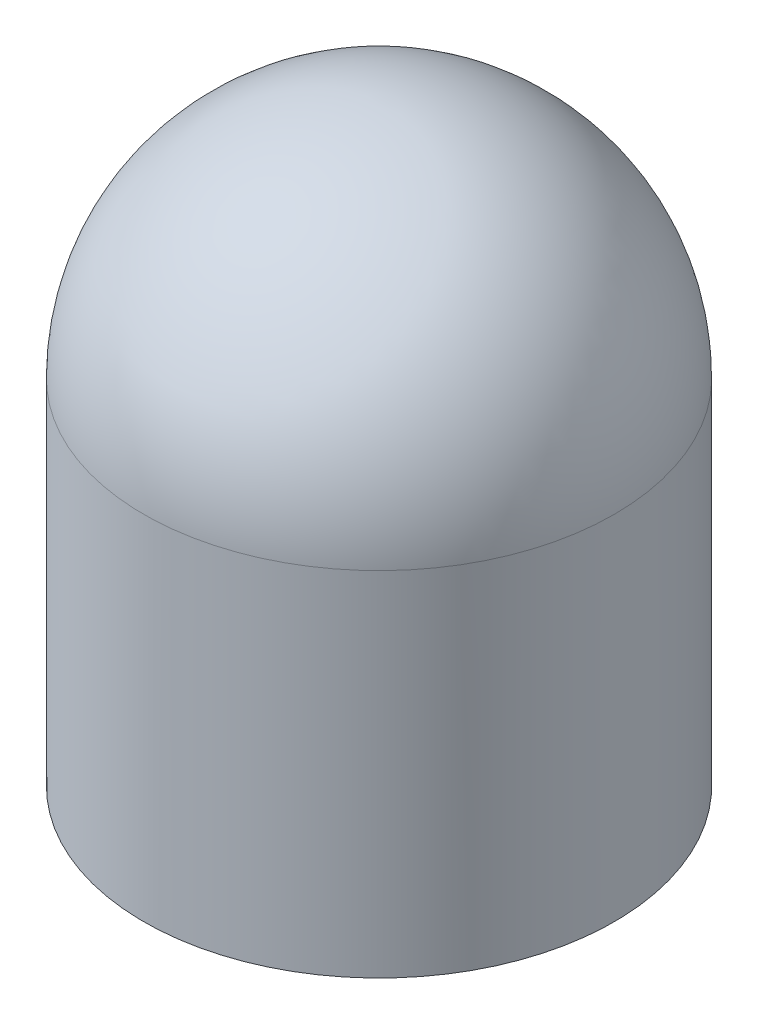
ISO-10303-21;
HEADER;
FILE_DESCRIPTION(('STEP AP214'),'2;1');
FILE_NAME('part.step','',(''),(''),'','','');
FILE_SCHEMA(('AUTOMOTIVE_DESIGN { 1 0 10303 214 1 1 1 1 }'));
ENDSEC;
DATA;
#1=APPLICATION_CONTEXT('core data for automotive mechanical design processes');
#2=APPLICATION_PROTOCOL_DEFINITION('international standard','automotive_design',2000,#1);
#3=PRODUCT_CONTEXT('',#1,'mechanical');
#4=PRODUCT('Part','Part','',(#3));
#5=PRODUCT_RELATED_PRODUCT_CATEGORY('part','',(#4));
#6=PRODUCT_DEFINITION_FORMATION('','',#4);
#7=PRODUCT_DEFINITION_CONTEXT('part definition',#1,'design');
#8=PRODUCT_DEFINITION('design','',#6,#7);
#9=PRODUCT_DEFINITION_SHAPE('','',#8);
#10=(LENGTH_UNIT() NAMED_UNIT(*) SI_UNIT(.MILLI.,.METRE.));
#11=(NAMED_UNIT(*) PLANE_ANGLE_UNIT() SI_UNIT($,.RADIAN.));
#12=(NAMED_UNIT(*) SI_UNIT($,.STERADIAN.) SOLID_ANGLE_UNIT());
#13=UNCERTAINTY_MEASURE_WITH_UNIT(LENGTH_MEASURE(1.E-05),#10,'distance_accuracy_value','');
#14=(GEOMETRIC_REPRESENTATION_CONTEXT(3) GLOBAL_UNCERTAINTY_ASSIGNED_CONTEXT((#13)) GLOBAL_UNIT_ASSIGNED_CONTEXT((#10,
#11,#12)) REPRESENTATION_CONTEXT('',''));
#15=CARTESIAN_POINT('',(0.,0.,0.));
#16=DIRECTION('',(0.,0.,1.));
#17=DIRECTION('',(1.,0.,0.));
#18=AXIS2_PLACEMENT_3D('',#15,#16,#17);
#19=CARTESIAN_POINT('',(-4.,-6.,0.));
#20=DIRECTION('',(0.,-1.,0.));
#21=DIRECTION('',(1.,0.,0.));
#22=AXIS2_PLACEMENT_3D('',#19,#20,#21);
#23=PLANE('',#22);
#24=CARTESIAN_POINT('',(0.,-6.,0.));
#25=DIRECTION('',(0.,1.,0.));
#26=DIRECTION('',(-1.,0.,0.));
#27=AXIS2_PLACEMENT_3D('',#24,#25,#26);
#28=CIRCLE('',#27,4.);
#29=CARTESIAN_POINT('',(-4.,-6.,0.));
#30=VERTEX_POINT('',#29);
#31=EDGE_CURVE('E220',#30,#30,#28,.T.);
#32=ORIENTED_EDGE('',*,*,#31,.F.);
#33=EDGE_LOOP('',(#32));
#34=FACE_BOUND('',#33,.T.);
#35=CARTESIAN_POINT('',(0.,-6.,0.));
#36=DIRECTION('',(0.,1.,0.));
#37=DIRECTION('',(-1.,0.,0.));
#38=AXIS2_PLACEMENT_3D('',#35,#36,#37);
#39=CIRCLE('',#38,1.5);
#40=CARTESIAN_POINT('',(-1.5,-6.,0.));
#41=VERTEX_POINT('',#40);
#42=EDGE_CURVE('E42',#41,#41,#39,.T.);
#43=ORIENTED_EDGE('',*,*,#42,.T.);
#44=EDGE_LOOP('',(#43));
#45=FACE_BOUND('',#44,.T.);
#46=CARTESIAN_POINT('',(-0.689240214724091,-6.,2.54134512307046));
#47=CARTESIAN_POINT('',(-0.689536199097216,-6.,2.51759825447027));
#48=CARTESIAN_POINT('',(-0.690112578303589,-6.,2.47135526828453));
#49=CARTESIAN_POINT('',(-0.693085762476472,-6.,2.40375862491754));
#50=CARTESIAN_POINT('',(-0.699013134150513,-6.,2.33982889306101));
#51=CARTESIAN_POINT('',(-0.706311274624241,-6.,2.27938663853422));
#52=CARTESIAN_POINT('',(-0.716548087620726,-6.,2.22261542787235));
#53=CARTESIAN_POINT('',(-0.729012581895578,-6.,2.16948526939035));
#54=CARTESIAN_POINT('',(-0.74299050428232,-6.,2.11971681982881));
#55=CARTESIAN_POINT('',(-0.760077837501126,-6.,2.07374625786807));
#56=CARTESIAN_POINT('',(-0.778998467582404,-6.,2.03079987183004));
#57=CARTESIAN_POINT('',(-0.799526075129496,-6.,1.99045447008974));
#58=CARTESIAN_POINT('',(-0.822133942785623,-6.,1.9526305464897));
#59=CARTESIAN_POINT('',(-0.847166636218612,-6.,1.91773848557038));
#60=CARTESIAN_POINT('',(-0.873431330692381,-6.,1.88468037576528));
#61=CARTESIAN_POINT('',(-0.902069059262447,-6.,1.85460516888828));
#62=CARTESIAN_POINT('',(-0.93255790979147,-6.,1.82693961195807));
#63=CARTESIAN_POINT('',(-0.964824140324806,-6.,1.80203603615234));
#64=CARTESIAN_POINT('',(-0.998498431339888,-6.,1.77957801286812));
#65=CARTESIAN_POINT('',(-1.0337920285347,-6.,1.76062072744707));
#66=CARTESIAN_POINT('',(-1.06981526151234,-6.,1.74379424892377));
#67=CARTESIAN_POINT('',(-1.10737243366101,-6.,1.73104226542974));
#68=CARTESIAN_POINT('',(-1.14570222323156,-6.,1.7201594937138));
#69=CARTESIAN_POINT('',(-1.18545004671189,-6.,1.71312980410232));
#70=CARTESIAN_POINT('',(-1.22624692810089,-6.,1.70847554974479));
#71=CARTESIAN_POINT('',(-1.25379872222199,-6.,1.70784441290312));
#72=CARTESIAN_POINT('',(-1.26769824757665,-6.,1.70752601249354));
#73=B_SPLINE_CURVE_WITH_KNOTS('',3,(#46,#47,#48,#49,#50,#51,#52,#53,#54,#55,#56,#57,#58,#59,#60,
#61,#62,#63,#64,#65,#66,#67,#68,#69,#70,#71,#72),.UNSPECIFIED.,.F.,.F.,(4,1,1,1,1,1,1,1,1,1,1,1,
1,1,1,1,1,1,1,1,1,1,1,1,4),(0.,0.0623586453206339,0.12143285174451,0.177603568781527,
0.230908870189653,0.281248082532962,0.328981984140903,0.374173859287638,0.416883780346531,
0.457636953082946,0.497347357171603,0.535678859847328,0.573212797882683,0.610031936792102,
0.64645653009802,0.682124568197924,0.718035057366356,0.753392216561028,0.788268423631282,
0.823144630701536,0.857652357822317,0.892293412913463,0.927670287386935,0.963510591363239,1.),.UNSPECIFIED.);
#74=CARTESIAN_POINT('',(-0.689240214724091,-6.,2.54134512307046));
#75=VERTEX_POINT('',#74);
#76=CARTESIAN_POINT('',(-1.26769824757665,-6.,1.70752601249354));
#77=VERTEX_POINT('',#76);
#78=EDGE_CURVE('E198',#75,#77,#73,.T.);
#79=ORIENTED_EDGE('',*,*,#78,.T.);
#80=CARTESIAN_POINT('',(-1.26769824757665,-6.,1.70752601249354));
#81=CARTESIAN_POINT('',(-1.28053558986095,-6.,1.70774414392937));
#82=CARTESIAN_POINT('',(-1.30596086167798,-6.,1.70817616879284));
#83=CARTESIAN_POINT('',(-1.34350535563089,-6.,1.71241331828519));
#84=CARTESIAN_POINT('',(-1.38007908003425,-6.,1.71944550524835));
#85=CARTESIAN_POINT('',(-1.41557461639022,-6.,1.72930141508242));
#86=CARTESIAN_POINT('',(-1.45024136222225,-6.,1.74181463360485));
#87=CARTESIAN_POINT('',(-1.4839289806116,-6.,1.75697264850056));
#88=CARTESIAN_POINT('',(-1.51641605222219,-6.,1.77532715100472));
#89=CARTESIAN_POINT('',(-1.54801260969687,-6.,1.79594997851893));
#90=CARTESIAN_POINT('',(-1.57825976304605,-6.,1.81940692806055));
#91=CARTESIAN_POINT('',(-1.60643289971863,-6.,1.84591915253008));
#92=CARTESIAN_POINT('',(-1.63320939403412,-6.,1.87485304777998));
#93=CARTESIAN_POINT('',(-1.65805878504017,-6.,1.90652062850967));
#94=CARTESIAN_POINT('',(-1.68153021000039,-6.,1.94071746729887));
#95=CARTESIAN_POINT('',(-1.70268935037513,-6.,1.97776574264178));
#96=CARTESIAN_POINT('',(-1.72241653500416,-6.,2.01726976624226));
#97=CARTESIAN_POINT('',(-1.74070611243833,-6.,2.05953381487989));
#98=CARTESIAN_POINT('',(-1.75721987654702,-6.,2.1052922044059));
#99=CARTESIAN_POINT('',(-1.7703910907676,-6.,2.15544015771024));
#100=CARTESIAN_POINT('',(-1.78281141768306,-6.,2.20943046625308));
#101=CARTESIAN_POINT('',(-1.79192614964581,-6.,2.26780931408946));
#102=CARTESIAN_POINT('',(-1.79983435768237,-6.,2.33013628007546));
#103=CARTESIAN_POINT('',(-1.80442236132525,-6.,2.39681596500461));
#104=CARTESIAN_POINT('',(-1.80834316360539,-6.,2.46762722315272));
#105=CARTESIAN_POINT('',(-1.80853345422731,-6.,2.51632197046676));
#106=CARTESIAN_POINT('',(-1.80863124036512,-6.,2.54134512307046));
#107=B_SPLINE_CURVE_WITH_KNOTS('',3,(#80,#81,#82,#83,#84,#85,#86,#87,#88,#89,#90,#91,#92,#93,
#94,#95,#96,#97,#98,#99,#100,#101,#102,#103,#104,#105,#106),.UNSPECIFIED.,.F.,.F.,(4,1,1,1,1,1,
1,1,1,1,1,1,1,1,1,1,1,1,1,1,1,1,1,1,4),(0.,0.0344225308328632,0.0681762769639792,
0.101187772496387,0.134229865398911,0.166878146477554,0.199963028159511,0.233185680290985,
0.266859095929362,0.30109795070752,0.335699678315082,0.370509883523512,0.406744747626816,
0.44357378340377,0.481662118120272,0.521080332339255,0.561961378968866,0.605128761767043,
0.651412326594914,0.700940996887038,0.753667628438233,0.809812230705577,0.869410747775484,
0.932893074365033,1.),.UNSPECIFIED.);
#108=CARTESIAN_POINT('',(-1.80863124036512,-6.,2.54134512307046));
#109=VERTEX_POINT('',#108);
#110=EDGE_CURVE('E49',#77,#109,#107,.T.);
#111=ORIENTED_EDGE('',*,*,#110,.T.);
#112=CARTESIAN_POINT('',(-1.80863124036512,-6.,2.54134512307046));
#113=CARTESIAN_POINT('',(-1.80847972134234,-6.,2.56657694528547));
#114=CARTESIAN_POINT('',(-1.80818546548435,-6.,2.61557812915216));
#115=CARTESIAN_POINT('',(-1.80501472884601,-6.,2.68686230099009));
#116=CARTESIAN_POINT('',(-1.7995449734972,-6.,2.75377319847406));
#117=CARTESIAN_POINT('',(-1.79251926508434,-6.,2.81631280699261));
#118=CARTESIAN_POINT('',(-1.7827993838769,-6.,2.87452409488967));
#119=CARTESIAN_POINT('',(-1.77167782639397,-6.,2.92843582799789));
#120=CARTESIAN_POINT('',(-1.75798752965164,-6.,2.97805463901731));
#121=CARTESIAN_POINT('',(-1.74199679399402,-6.,3.02346906767935));
#122=CARTESIAN_POINT('',(-1.72404241371625,-6.,3.06548568952795));
#123=CARTESIAN_POINT('',(-1.70430148730477,-6.,3.10463080226668));
#124=CARTESIAN_POINT('',(-1.68289904357066,-6.,3.14140140395366));
#125=CARTESIAN_POINT('',(-1.65997963303194,-6.,3.17578468772339));
#126=CARTESIAN_POINT('',(-1.63445969455221,-6.,3.20701464233675));
#127=CARTESIAN_POINT('',(-1.60783742221483,-6.,3.23616080368768));
#128=CARTESIAN_POINT('',(-1.57911321187012,-6.,3.262654215638));
#129=CARTESIAN_POINT('',(-1.54855029558827,-6.,3.28636224129231));
#130=CARTESIAN_POINT('',(-1.51693460237058,-6.,3.30779656352852));
#131=CARTESIAN_POINT('',(-1.48389229946679,-6.,3.32586283902085));
#132=CARTESIAN_POINT('',(-1.45018899082498,-6.,3.34160028641933));
#133=CARTESIAN_POINT('',(-1.41539488397182,-6.,3.35433051551227));
#134=CARTESIAN_POINT('',(-1.37976225185001,-6.,3.36421947660066));
#135=CARTESIAN_POINT('',(-1.34316348254342,-6.,3.37112548898255));
#136=CARTESIAN_POINT('',(-1.30577260726787,-6.,3.37588126374165));
#137=CARTESIAN_POINT('',(-1.28043350848277,-6.,3.37625062860409));
#138=CARTESIAN_POINT('',(-1.26769824757665,-6.,3.37643626890379));
#139=B_SPLINE_CURVE_WITH_KNOTS('',3,(#112,#113,#114,#115,#116,#117,#118,#119,#120,#121,#122,
#123,#124,#125,#126,#127,#128,#129,#130,#131,#132,#133,#134,#135,#136,#137,#138),.UNSPECIFIED.,
.F.,.F.,(4,1,1,1,1,1,1,1,1,1,1,1,1,1,1,1,1,1,1,1,1,1,1,1,4),(0.,0.0676053550869947,
0.131292239092441,0.191134407589382,0.247469080878901,0.299860761122208,0.349217260576119,
0.394905185014992,0.437665207287398,0.478130768490371,0.517254263570062,0.555057411187313,
0.592083229925926,0.627836499527122,0.663011964810908,0.697786070664216,0.732388072475915,
0.76657726534607,0.800013696791229,0.833182443527639,0.866160928196942,0.89916875533635,
0.932146016836145,0.965897043677855,1.),.UNSPECIFIED.);
#140=CARTESIAN_POINT('',(-1.26769824757665,-6.,3.37643626890379));
#141=VERTEX_POINT('',#140);
#142=EDGE_CURVE('E182',#109,#141,#139,.T.);
#143=ORIENTED_EDGE('',*,*,#142,.T.);
#144=CARTESIAN_POINT('',(-1.26769824757665,-6.,3.37643626890379));
#145=CARTESIAN_POINT('',(-1.25380546877539,-6.,3.37607041699541));
#146=CARTESIAN_POINT('',(-1.22638359099794,-6.,3.37534829030933));
#147=CARTESIAN_POINT('',(-1.18568820173261,-6.,3.37141843334135));
#148=CARTESIAN_POINT('',(-1.14635723423574,-6.,3.36347881464248));
#149=CARTESIAN_POINT('',(-1.10785104859553,-6.,3.35352222364146));
#150=CARTESIAN_POINT('',(-1.07079334913682,-6.,3.33991134820215));
#151=CARTESIAN_POINT('',(-1.03445006891413,-6.,3.32425946550055));
#152=CARTESIAN_POINT('',(-0.999939833413975,-6.,3.30443489085294));
#153=CARTESIAN_POINT('',(-0.966085568087182,-6.,3.28274949915098));
#154=CARTESIAN_POINT('',(-0.934048036061106,-6.,3.25774195999854));
#155=CARTESIAN_POINT('',(-0.903405407764587,-6.,3.23056951795135));
#156=CARTESIAN_POINT('',(-0.875113050886327,-6.,3.20030463893899));
#157=CARTESIAN_POINT('',(-0.848139657402634,-6.,3.16798873015798));
#158=CARTESIAN_POINT('',(-0.823868807181571,-6.,3.13235616898861));
#159=CARTESIAN_POINT('',(-0.800763662400706,-6.,3.09465465428405));
#160=CARTESIAN_POINT('',(-0.780305531589507,-6.,3.05394524045789));
#161=CARTESIAN_POINT('',(-0.760895229415662,-6.,3.01094807583721));
#162=CARTESIAN_POINT('',(-0.744210920441577,-6.,2.96451986635338));
#163=CARTESIAN_POINT('',(-0.729110025141549,-6.,2.91492575032445));
#164=CARTESIAN_POINT('',(-0.716872401623192,-6.,2.86154784350466));
#165=CARTESIAN_POINT('',(-0.706720881778917,-6.,2.80455203286641));
#166=CARTESIAN_POINT('',(-0.698897695077107,-6.,2.74384236116663));
#167=CARTESIAN_POINT('',(-0.693120071652077,-6.,2.67956303752912));
#168=CARTESIAN_POINT('',(-0.69010359629423,-6.,2.61165396632493));
#169=CARTESIAN_POINT('',(-0.689533128750874,-6.,2.56519836143967));
#170=CARTESIAN_POINT('',(-0.689240214724091,-6.,2.54134512307046));
#171=B_SPLINE_CURVE_WITH_KNOTS('',3,(#144,#145,#146,#147,#148,#149,#150,#151,#152,#153,#154,
#155,#156,#157,#158,#159,#160,#161,#162,#163,#164,#165,#166,#167,#168,#169,#170),.UNSPECIFIED.,
.F.,.F.,(4,1,1,1,1,1,1,1,1,1,1,1,1,1,1,1,1,1,1,1,1,1,1,1,4),(0.,0.0364607246479962,
0.0719669944563689,0.107094350499589,0.141635469301944,0.1762090447318,0.210576168718885,
0.245316025921393,0.280492893555501,0.315984999859498,0.351831672796789,0.387834451996472,
0.424584677800379,0.46215711148296,0.500840299552222,0.540519487657194,0.581607489200195,
0.624544950174747,0.66985862220502,0.717555000631616,0.768128401084353,0.821703127541867,
0.878106709824406,0.937412294741432,1.),.UNSPECIFIED.);
#172=EDGE_CURVE('E190',#141,#75,#171,.T.);
#173=ORIENTED_EDGE('',*,*,#172,.T.);
#174=EDGE_LOOP('',(#79,#111,#143,#173));
#175=FACE_BOUND('',#174,.T.);
#176=ADVANCED_FACE('F34',(#34,#45,#175),#23,.T.);
#177=CARTESIAN_POINT('',(0.,0.,0.));
#178=DIRECTION('',(0.,1.,0.));
#179=DIRECTION('',(1.,0.,0.));
#180=AXIS2_PLACEMENT_3D('',#177,#178,#179);
#181=SPHERICAL_SURFACE('',#180,4.);
#182=CARTESIAN_POINT('',(0.,0.,0.));
#183=DIRECTION('',(0.,1.,0.));
#184=DIRECTION('',(-1.,0.,0.));
#185=AXIS2_PLACEMENT_3D('',#182,#183,#184);
#186=CIRCLE('',#185,4.);
#187=CARTESIAN_POINT('',(-4.,0.,0.));
#188=VERTEX_POINT('',#187);
#189=EDGE_CURVE('E217',#188,#188,#186,.T.);
#190=ORIENTED_EDGE('',*,*,#189,.T.);
#191=EDGE_LOOP('',(#190));
#192=FACE_BOUND('',#191,.T.);
#193=ADVANCED_FACE('F36',(#192),#181,.T.);
#194=CARTESIAN_POINT('',(-1.5,-3.,0.));
#195=DIRECTION('',(0.,-1.,0.));
#196=DIRECTION('',(1.,0.,0.));
#197=AXIS2_PLACEMENT_3D('',#194,#195,#196);
#198=PLANE('',#197);
#199=CARTESIAN_POINT('',(0.,-3.,0.));
#200=DIRECTION('',(0.,1.,0.));
#201=DIRECTION('',(-1.,0.,0.));
#202=AXIS2_PLACEMENT_3D('',#199,#200,#201);
#203=CIRCLE('',#202,1.5);
#204=CARTESIAN_POINT('',(-1.5,-3.,0.));
#205=VERTEX_POINT('',#204);
#206=EDGE_CURVE('E11',#205,#205,#203,.T.);
#207=ORIENTED_EDGE('',*,*,#206,.F.);
#208=EDGE_LOOP('',(#207));
#209=FACE_BOUND('',#208,.T.);
#210=ADVANCED_FACE('F230',(#209),#198,.T.);
#211=CARTESIAN_POINT('',(0.,4.,0.));
#212=DIRECTION('',(0.,1.,0.));
#213=DIRECTION('',(-1.,0.,0.));
#214=AXIS2_PLACEMENT_3D('',#211,#212,#213);
#215=CYLINDRICAL_SURFACE('',#214,1.5);
#216=ORIENTED_EDGE('',*,*,#206,.T.);
#217=EDGE_LOOP('',(#216));
#218=FACE_BOUND('',#217,.T.);
#219=ORIENTED_EDGE('',*,*,#42,.F.);
#220=EDGE_LOOP('',(#219));
#221=FACE_BOUND('',#220,.T.);
#222=ADVANCED_FACE('F227',(#218,#221),#215,.F.);
#223=CARTESIAN_POINT('',(0.,4.,0.));
#224=DIRECTION('',(0.,1.,0.));
#225=DIRECTION('',(-1.,0.,0.));
#226=AXIS2_PLACEMENT_3D('',#223,#224,#225);
#227=CYLINDRICAL_SURFACE('',#226,4.);
#228=ORIENTED_EDGE('',*,*,#31,.T.);
#229=EDGE_LOOP('',(#228));
#230=FACE_BOUND('',#229,.T.);
#231=ORIENTED_EDGE('',*,*,#189,.F.);
#232=EDGE_LOOP('',(#231));
#233=FACE_BOUND('',#232,.T.);
#234=ADVANCED_FACE('F229',(#230,#233),#227,.T.);
#235=CARTESIAN_POINT('',(-1.26769824757665,-5.,1.70752601249354));
#236=CARTESIAN_POINT('',(-1.28053558986095,-5.,1.70774414392937));
#237=CARTESIAN_POINT('',(-1.30596086167798,-5.,1.70817616879284));
#238=CARTESIAN_POINT('',(-1.34350535563089,-5.,1.71241331828519));
#239=CARTESIAN_POINT('',(-1.38007908003425,-5.,1.71944550524835));
#240=CARTESIAN_POINT('',(-1.41557461639022,-5.,1.72930141508242));
#241=CARTESIAN_POINT('',(-1.45024136222225,-5.,1.74181463360485));
#242=CARTESIAN_POINT('',(-1.4839289806116,-5.,1.75697264850056));
#243=CARTESIAN_POINT('',(-1.51641605222219,-5.,1.77532715100472));
#244=CARTESIAN_POINT('',(-1.54801260969687,-5.,1.79594997851893));
#245=CARTESIAN_POINT('',(-1.57825976304605,-5.,1.81940692806055));
#246=CARTESIAN_POINT('',(-1.60643289971863,-5.,1.84591915253008));
#247=CARTESIAN_POINT('',(-1.63320939403412,-5.,1.87485304777998));
#248=CARTESIAN_POINT('',(-1.65805878504017,-5.,1.90652062850967));
#249=CARTESIAN_POINT('',(-1.68153021000039,-5.,1.94071746729887));
#250=CARTESIAN_POINT('',(-1.70268935037513,-5.,1.97776574264178));
#251=CARTESIAN_POINT('',(-1.72241653500416,-5.,2.01726976624226));
#252=CARTESIAN_POINT('',(-1.74070611243833,-5.,2.05953381487989));
#253=CARTESIAN_POINT('',(-1.75721987654702,-5.,2.1052922044059));
#254=CARTESIAN_POINT('',(-1.7703910907676,-5.,2.15544015771024));
#255=CARTESIAN_POINT('',(-1.78281141768306,-5.,2.20943046625308));
#256=CARTESIAN_POINT('',(-1.79192614964581,-5.,2.26780931408946));
#257=CARTESIAN_POINT('',(-1.79983435768237,-5.,2.33013628007546));
#258=CARTESIAN_POINT('',(-1.80442236132525,-5.,2.39681596500461));
#259=CARTESIAN_POINT('',(-1.80834316360539,-5.,2.46762722315272));
#260=CARTESIAN_POINT('',(-1.80853345422731,-5.,2.51632197046676));
#261=CARTESIAN_POINT('',(-1.80863124036512,-5.,2.54134512307046));
#262=B_SPLINE_CURVE_WITH_KNOTS('',3,(#235,#236,#237,#238,#239,#240,#241,#242,#243,#244,#245,
#246,#247,#248,#249,#250,#251,#252,#253,#254,#255,#256,#257,#258,#259,#260,#261),.UNSPECIFIED.,
.F.,.F.,(4,1,1,1,1,1,1,1,1,1,1,1,1,1,1,1,1,1,1,1,1,1,1,1,4),(0.,0.0344225308328632,
0.0681762769639792,0.101187772496387,0.134229865398911,0.166878146477554,0.199963028159511,
0.233185680290985,0.266859095929362,0.30109795070752,0.335699678315082,0.370509883523512,
0.406744747626816,0.44357378340377,0.481662118120272,0.521080332339255,0.561961378968866,
0.605128761767043,0.651412326594914,0.700940996887038,0.753667628438233,0.809812230705577,
0.869410747775484,0.932893074365033,1.),.UNSPECIFIED.);
#263=DIRECTION('',(0.,-1.,0.));
#264=VECTOR('',#263,1.);
#265=SURFACE_OF_LINEAR_EXTRUSION('',#262,#264);
#266=ORIENTED_EDGE('',*,*,#110,.F.);
#267=DIRECTION('',(0.,-1.,0.));
#268=VECTOR('',#267,1.);
#269=CARTESIAN_POINT('',(-1.26769824757665,-5.,1.70752601249354));
#270=LINE('',#269,#268);
#271=CARTESIAN_POINT('',(-1.26769824757665,-5.,1.70752601249354));
#272=VERTEX_POINT('',#271);
#273=EDGE_CURVE('E170',#272,#77,#270,.T.);
#274=ORIENTED_EDGE('',*,*,#273,.F.);
#275=CARTESIAN_POINT('',(-1.80863124036512,-5.,2.54134512307046));
#276=VERTEX_POINT('',#275);
#277=EDGE_CURVE('E206',#272,#276,#262,.T.);
#278=ORIENTED_EDGE('',*,*,#277,.T.);
#279=DIRECTION('',(0.,-1.,0.));
#280=VECTOR('',#279,1.);
#281=CARTESIAN_POINT('',(-1.80863124036512,-5.,2.54134512307046));
#282=LINE('',#281,#280);
#283=EDGE_CURVE('E215',#276,#109,#282,.T.);
#284=ORIENTED_EDGE('',*,*,#283,.T.);
#285=EDGE_LOOP('',(#266,#274,#278,#284));
#286=FACE_BOUND('',#285,.T.);
#287=ADVANCED_FACE('F237',(#286),#265,.T.);
#288=CARTESIAN_POINT('',(-1.80863124036512,-5.,2.54134512307046));
#289=CARTESIAN_POINT('',(-1.80847972134234,-5.,2.56657694528547));
#290=CARTESIAN_POINT('',(-1.80818546548435,-5.,2.61557812915216));
#291=CARTESIAN_POINT('',(-1.80501472884601,-5.,2.68686230099009));
#292=CARTESIAN_POINT('',(-1.7995449734972,-5.,2.75377319847406));
#293=CARTESIAN_POINT('',(-1.79251926508434,-5.,2.81631280699261));
#294=CARTESIAN_POINT('',(-1.7827993838769,-5.,2.87452409488967));
#295=CARTESIAN_POINT('',(-1.77167782639397,-5.,2.92843582799789));
#296=CARTESIAN_POINT('',(-1.75798752965164,-5.,2.97805463901731));
#297=CARTESIAN_POINT('',(-1.74199679399402,-5.,3.02346906767935));
#298=CARTESIAN_POINT('',(-1.72404241371625,-5.,3.06548568952795));
#299=CARTESIAN_POINT('',(-1.70430148730477,-5.,3.10463080226668));
#300=CARTESIAN_POINT('',(-1.68289904357066,-5.,3.14140140395366));
#301=CARTESIAN_POINT('',(-1.65997963303194,-5.,3.17578468772339));
#302=CARTESIAN_POINT('',(-1.63445969455221,-5.,3.20701464233675));
#303=CARTESIAN_POINT('',(-1.60783742221483,-5.,3.23616080368768));
#304=CARTESIAN_POINT('',(-1.57911321187012,-5.,3.262654215638));
#305=CARTESIAN_POINT('',(-1.54855029558827,-5.,3.28636224129231));
#306=CARTESIAN_POINT('',(-1.51693460237058,-5.,3.30779656352852));
#307=CARTESIAN_POINT('',(-1.48389229946679,-5.,3.32586283902085));
#308=CARTESIAN_POINT('',(-1.45018899082498,-5.,3.34160028641933));
#309=CARTESIAN_POINT('',(-1.41539488397182,-5.,3.35433051551227));
#310=CARTESIAN_POINT('',(-1.37976225185001,-5.,3.36421947660066));
#311=CARTESIAN_POINT('',(-1.34316348254342,-5.,3.37112548898255));
#312=CARTESIAN_POINT('',(-1.30577260726787,-5.,3.37588126374165));
#313=CARTESIAN_POINT('',(-1.28043350848277,-5.,3.37625062860409));
#314=CARTESIAN_POINT('',(-1.26769824757665,-5.,3.37643626890379));
#315=B_SPLINE_CURVE_WITH_KNOTS('',3,(#288,#289,#290,#291,#292,#293,#294,#295,#296,#297,#298,
#299,#300,#301,#302,#303,#304,#305,#306,#307,#308,#309,#310,#311,#312,#313,#314),.UNSPECIFIED.,
.F.,.F.,(4,1,1,1,1,1,1,1,1,1,1,1,1,1,1,1,1,1,1,1,1,1,1,1,4),(0.,0.0676053550869947,
0.131292239092441,0.191134407589382,0.247469080878901,0.299860761122208,0.349217260576119,
0.394905185014992,0.437665207287398,0.478130768490371,0.517254263570062,0.555057411187313,
0.592083229925926,0.627836499527122,0.663011964810908,0.697786070664216,0.732388072475915,
0.76657726534607,0.800013696791229,0.833182443527639,0.866160928196942,0.89916875533635,
0.932146016836145,0.965897043677855,1.),.UNSPECIFIED.);
#316=DIRECTION('',(0.,-1.,0.));
#317=VECTOR('',#316,1.);
#318=SURFACE_OF_LINEAR_EXTRUSION('',#315,#317);
#319=ORIENTED_EDGE('',*,*,#142,.F.);
#320=ORIENTED_EDGE('',*,*,#283,.F.);
#321=CARTESIAN_POINT('',(-1.26769824757665,-5.,3.37643626890379));
#322=VERTEX_POINT('',#321);
#323=EDGE_CURVE('E306',#276,#322,#315,.T.);
#324=ORIENTED_EDGE('',*,*,#323,.T.);
#325=DIRECTION('',(0.,-1.,0.));
#326=VECTOR('',#325,1.);
#327=CARTESIAN_POINT('',(-1.26769824757665,-5.,3.37643626890379));
#328=LINE('',#327,#326);
#329=EDGE_CURVE('E213',#322,#141,#328,.T.);
#330=ORIENTED_EDGE('',*,*,#329,.T.);
#331=EDGE_LOOP('',(#319,#320,#324,#330));
#332=FACE_BOUND('',#331,.T.);
#333=ADVANCED_FACE('F315',(#332),#318,.T.);
#334=CARTESIAN_POINT('',(-1.26769824757665,-5.,3.37643626890379));
#335=CARTESIAN_POINT('',(-1.25380546877539,-5.,3.37607041699541));
#336=CARTESIAN_POINT('',(-1.22638359099794,-5.,3.37534829030933));
#337=CARTESIAN_POINT('',(-1.18568820173261,-5.,3.37141843334135));
#338=CARTESIAN_POINT('',(-1.14635723423574,-5.,3.36347881464248));
#339=CARTESIAN_POINT('',(-1.10785104859553,-5.,3.35352222364146));
#340=CARTESIAN_POINT('',(-1.07079334913682,-5.,3.33991134820215));
#341=CARTESIAN_POINT('',(-1.03445006891413,-5.,3.32425946550055));
#342=CARTESIAN_POINT('',(-0.999939833413975,-5.,3.30443489085294));
#343=CARTESIAN_POINT('',(-0.966085568087182,-5.,3.28274949915098));
#344=CARTESIAN_POINT('',(-0.934048036061106,-5.,3.25774195999854));
#345=CARTESIAN_POINT('',(-0.903405407764587,-5.,3.23056951795135));
#346=CARTESIAN_POINT('',(-0.875113050886327,-5.,3.20030463893899));
#347=CARTESIAN_POINT('',(-0.848139657402634,-5.,3.16798873015798));
#348=CARTESIAN_POINT('',(-0.82386880718157,-5.,3.13235616898861));
#349=CARTESIAN_POINT('',(-0.800763662400706,-5.,3.09465465428405));
#350=CARTESIAN_POINT('',(-0.780305531589507,-5.,3.05394524045789));
#351=CARTESIAN_POINT('',(-0.760895229415662,-5.,3.01094807583721));
#352=CARTESIAN_POINT('',(-0.744210920441577,-5.,2.96451986635338));
#353=CARTESIAN_POINT('',(-0.729110025141549,-5.,2.91492575032445));
#354=CARTESIAN_POINT('',(-0.716872401623191,-5.,2.86154784350466));
#355=CARTESIAN_POINT('',(-0.706720881778916,-5.,2.80455203286641));
#356=CARTESIAN_POINT('',(-0.698897695077107,-5.,2.74384236116663));
#357=CARTESIAN_POINT('',(-0.693120071652077,-5.,2.67956303752912));
#358=CARTESIAN_POINT('',(-0.69010359629423,-5.,2.61165396632493));
#359=CARTESIAN_POINT('',(-0.689533128750874,-5.,2.56519836143967));
#360=CARTESIAN_POINT('',(-0.689240214724091,-5.,2.54134512307046));
#361=B_SPLINE_CURVE_WITH_KNOTS('',3,(#334,#335,#336,#337,#338,#339,#340,#341,#342,#343,#344,
#345,#346,#347,#348,#349,#350,#351,#352,#353,#354,#355,#356,#357,#358,#359,#360),.UNSPECIFIED.,
.F.,.F.,(4,1,1,1,1,1,1,1,1,1,1,1,1,1,1,1,1,1,1,1,1,1,1,1,4),(0.,0.0364607246479962,
0.0719669944563689,0.107094350499589,0.141635469301944,0.1762090447318,0.210576168718885,
0.245316025921393,0.280492893555501,0.315984999859498,0.351831672796789,0.387834451996472,
0.424584677800379,0.46215711148296,0.500840299552222,0.540519487657194,0.581607489200195,
0.624544950174747,0.66985862220502,0.717555000631616,0.768128401084353,0.821703127541867,
0.878106709824406,0.937412294741432,1.),.UNSPECIFIED.);
#362=DIRECTION('',(0.,-1.,0.));
#363=VECTOR('',#362,1.);
#364=SURFACE_OF_LINEAR_EXTRUSION('',#361,#363);
#365=ORIENTED_EDGE('',*,*,#172,.F.);
#366=ORIENTED_EDGE('',*,*,#329,.F.);
#367=CARTESIAN_POINT('',(-0.689240214724091,-5.,2.54134512307046));
#368=VERTEX_POINT('',#367);
#369=EDGE_CURVE('E171',#322,#368,#361,.T.);
#370=ORIENTED_EDGE('',*,*,#369,.T.);
#371=DIRECTION('',(0.,-1.,0.));
#372=VECTOR('',#371,1.);
#373=CARTESIAN_POINT('',(-0.689240214724091,-5.,2.54134512307046));
#374=LINE('',#373,#372);
#375=EDGE_CURVE('E211',#368,#75,#374,.T.);
#376=ORIENTED_EDGE('',*,*,#375,.T.);
#377=EDGE_LOOP('',(#365,#366,#370,#376));
#378=FACE_BOUND('',#377,.T.);
#379=ADVANCED_FACE('F161',(#378),#364,.T.);
#380=CARTESIAN_POINT('',(-0.689240214724091,-5.,2.54134512307046));
#381=CARTESIAN_POINT('',(-0.689536199097216,-5.,2.51759825447027));
#382=CARTESIAN_POINT('',(-0.690112578303589,-5.,2.47135526828453));
#383=CARTESIAN_POINT('',(-0.693085762476472,-5.,2.40375862491754));
#384=CARTESIAN_POINT('',(-0.699013134150513,-5.,2.33982889306101));
#385=CARTESIAN_POINT('',(-0.706311274624241,-5.,2.27938663853422));
#386=CARTESIAN_POINT('',(-0.716548087620726,-5.,2.22261542787235));
#387=CARTESIAN_POINT('',(-0.729012581895578,-5.,2.16948526939035));
#388=CARTESIAN_POINT('',(-0.74299050428232,-5.,2.11971681982881));
#389=CARTESIAN_POINT('',(-0.760077837501126,-5.,2.07374625786807));
#390=CARTESIAN_POINT('',(-0.778998467582404,-5.,2.03079987183004));
#391=CARTESIAN_POINT('',(-0.799526075129495,-5.,1.99045447008974));
#392=CARTESIAN_POINT('',(-0.822133942785623,-5.,1.9526305464897));
#393=CARTESIAN_POINT('',(-0.847166636218612,-5.,1.91773848557038));
#394=CARTESIAN_POINT('',(-0.873431330692381,-5.,1.88468037576528));
#395=CARTESIAN_POINT('',(-0.902069059262447,-5.,1.85460516888828));
#396=CARTESIAN_POINT('',(-0.93255790979147,-5.,1.82693961195807));
#397=CARTESIAN_POINT('',(-0.964824140324806,-5.,1.80203603615234));
#398=CARTESIAN_POINT('',(-0.998498431339888,-5.,1.77957801286812));
#399=CARTESIAN_POINT('',(-1.0337920285347,-5.,1.76062072744707));
#400=CARTESIAN_POINT('',(-1.06981526151234,-5.,1.74379424892377));
#401=CARTESIAN_POINT('',(-1.10737243366101,-5.,1.73104226542974));
#402=CARTESIAN_POINT('',(-1.14570222323156,-5.,1.7201594937138));
#403=CARTESIAN_POINT('',(-1.18545004671189,-5.,1.71312980410232));
#404=CARTESIAN_POINT('',(-1.22624692810089,-5.,1.70847554974479));
#405=CARTESIAN_POINT('',(-1.25379872222199,-5.,1.70784441290312));
#406=CARTESIAN_POINT('',(-1.26769824757665,-5.,1.70752601249354));
#407=B_SPLINE_CURVE_WITH_KNOTS('',3,(#380,#381,#382,#383,#384,#385,#386,#387,#388,#389,#390,
#391,#392,#393,#394,#395,#396,#397,#398,#399,#400,#401,#402,#403,#404,#405,#406),.UNSPECIFIED.,
.F.,.F.,(4,1,1,1,1,1,1,1,1,1,1,1,1,1,1,1,1,1,1,1,1,1,1,1,4),(0.,0.0623586453206339,
0.12143285174451,0.177603568781527,0.230908870189653,0.281248082532962,0.328981984140903,
0.374173859287638,0.416883780346531,0.457636953082946,0.497347357171603,0.535678859847328,
0.573212797882683,0.610031936792102,0.64645653009802,0.682124568197924,0.718035057366356,
0.753392216561028,0.788268423631282,0.823144630701536,0.857652357822317,0.892293412913463,
0.927670287386935,0.963510591363239,1.),.UNSPECIFIED.);
#408=DIRECTION('',(0.,-1.,0.));
#409=VECTOR('',#408,1.);
#410=SURFACE_OF_LINEAR_EXTRUSION('',#407,#409);
#411=ORIENTED_EDGE('',*,*,#78,.F.);
#412=ORIENTED_EDGE('',*,*,#375,.F.);
#413=EDGE_CURVE('E165',#368,#272,#407,.T.);
#414=ORIENTED_EDGE('',*,*,#413,.T.);
#415=ORIENTED_EDGE('',*,*,#273,.T.);
#416=EDGE_LOOP('',(#411,#412,#414,#415));
#417=FACE_BOUND('',#416,.T.);
#418=ADVANCED_FACE('F157',(#417),#410,.T.);
#419=CARTESIAN_POINT('',(-1.71154224674528,-5.,1.99572555189682));
#420=DIRECTION('',(0.,-1.,9.41105707681436E-13));
#421=DIRECTION('',(0.,-9.41105707681436E-13,-1.));
#422=AXIS2_PLACEMENT_3D('',#419,#420,#421);
#423=PLANE('',#422);
#424=CARTESIAN_POINT('',(-0.892765855749732,-5.,2.54198114069866));
#425=CARTESIAN_POINT('',(-0.892815191726382,-5.,2.56074813600056));
#426=CARTESIAN_POINT('',(-0.892911405140395,-5.,2.59734691870153));
#427=CARTESIAN_POINT('',(-0.895770969421443,-5.,2.65088198356272));
#428=CARTESIAN_POINT('',(-0.899229307924383,-5.,2.70184022105135));
#429=CARTESIAN_POINT('',(-0.905195581947509,-5.,2.75005428125046));
#430=CARTESIAN_POINT('',(-0.911872777708258,-5.,2.79576477637239));
#431=CARTESIAN_POINT('',(-0.921031545001292,-5.,2.83864853360658));
#432=CARTESIAN_POINT('',(-0.930854848622382,-5.,2.87913366414942));
#433=CARTESIAN_POINT('',(-0.943127016025467,-5.,2.91672013855403));
#434=CARTESIAN_POINT('',(-0.956544156052803,-5.,2.95178709082591));
#435=CARTESIAN_POINT('',(-0.970695385167786,-5.,2.9844512451377));
#436=CARTESIAN_POINT('',(-0.985996372902785,-5.,3.01473873820152));
#437=CARTESIAN_POINT('',(-1.00285444475669,-5.,3.04226953990859));
#438=CARTESIAN_POINT('',(-1.02064746286941,-5.,3.06749779040298));
#439=CARTESIAN_POINT('',(-1.03944181108799,-5.,3.09027176469497));
#440=CARTESIAN_POINT('',(-1.05951754028811,-5.,3.11046327397762));
#441=CARTESIAN_POINT('',(-1.0875840924849,-5.,3.13322963183532));
#442=CARTESIAN_POINT('',(-1.12376540121914,-5.,3.15692447235648));
#443=CARTESIAN_POINT('',(-1.16900710619223,-5.,3.17818934325675));
#444=CARTESIAN_POINT('',(-1.21572369497247,-5.,3.1907256246617));
#445=CARTESIAN_POINT('',(-1.24727543685923,-5.,3.19242175117705));
#446=CARTESIAN_POINT('',(-1.26292811536512,-5.,3.19326319198072));
#447=B_SPLINE_CURVE_WITH_KNOTS('',3,(#424,#425,#426,#427,#428,#429,#430,#431,#432,#433,#434,
#435,#436,#437,#438,#439,#440,#441,#442,#443,#444,#445,#446),.UNSPECIFIED.,.F.,.F.,(4,1,1,1,1,1,
1,1,1,1,1,1,1,1,1,1,1,1,1,1,4),(0.,0.0676600788846769,0.131948481085904,0.193277995177203,
0.251783821570218,0.307086637720007,0.359786702103168,0.409847936514721,0.457232860293043,
0.502239416733454,0.545203143574748,0.585546693100257,0.624486011350747,0.661499793834529,
0.696785781288927,0.730841265354005,0.763974749451237,0.826949786803529,0.886296146781063,
0.943592025261097,1.),.UNSPECIFIED.);
#448=CARTESIAN_POINT('',(-0.892765855749732,-5.,2.54198114069866));
#449=VERTEX_POINT('',#448);
#450=CARTESIAN_POINT('',(-1.26292811536512,-5.,3.19326319198072));
#451=VERTEX_POINT('',#450);
#452=EDGE_CURVE('E119',#449,#451,#447,.T.);
#453=ORIENTED_EDGE('',*,*,#452,.F.);
#454=CARTESIAN_POINT('',(-0.950325451102296,-5.,2.149240255282));
#455=CARTESIAN_POINT('',(-0.9457379675717,-5.,2.16308486762658));
#456=CARTESIAN_POINT('',(-0.936386064559326,-5.,2.1913080690892));
#457=CARTESIAN_POINT('',(-0.92466941554355,-5.,2.23524972283418));
#458=CARTESIAN_POINT('',(-0.91496947255732,-5.,2.28135772512686));
#459=CARTESIAN_POINT('',(-0.906617281036439,-5.,2.32938652523297));
#460=CARTESIAN_POINT('',(-0.900275449613016,-5.,2.37957809023572));
#461=CARTESIAN_POINT('',(-0.895891911814641,-5.,2.43188407510283));
#462=CARTESIAN_POINT('',(-0.893377451373342,-5.,2.48630480123835));
#463=CARTESIAN_POINT('',(-0.892971987063267,-5.,2.52321606694281));
#464=CARTESIAN_POINT('',(-0.892765855749732,-5.,2.54198114069866));
#465=B_SPLINE_CURVE_WITH_KNOTS('',3,(#454,#455,#456,#457,#458,#459,#460,#461,#462,#463,#464),
.UNSPECIFIED.,.F.,.F.,(4,1,1,1,1,1,1,1,4),(0.,0.109702155293393,0.223635444075181,
0.341877052264139,0.464062227503856,0.590271833931524,0.722321972246363,0.858833107677814,1.),.UNSPECIFIED.);
#466=CARTESIAN_POINT('',(-0.950325451102296,-5.,2.149240255282));
#467=VERTEX_POINT('',#466);
#468=EDGE_CURVE('E449',#467,#449,#465,.T.);
#469=ORIENTED_EDGE('',*,*,#468,.F.);
#470=CARTESIAN_POINT('',(-1.26292811536512,-5.,1.89069908941661));
#471=CARTESIAN_POINT('',(-1.24685352206425,-5.,1.89154016790661));
#472=CARTESIAN_POINT('',(-1.21480436938542,-5.,1.8932170907647));
#473=CARTESIAN_POINT('',(-1.16760367684078,-5.,1.90542720948643));
#474=CARTESIAN_POINT('',(-1.12234598391402,-5.,1.92592017363193));
#475=CARTESIAN_POINT('',(-1.08648585531949,-5.,1.94907259069775));
#476=CARTESIAN_POINT('',(-1.05939208011296,-5.,1.97159114282243));
#477=CARTESIAN_POINT('',(-1.03982546346201,-5.,1.99076117402902));
#478=CARTESIAN_POINT('',(-1.0217906799271,-5.,2.01216319146014));
#479=CARTESIAN_POINT('',(-1.00476525588731,-5.,2.03547129401271));
#480=CARTESIAN_POINT('',(-0.989370848341542,-5.,2.06106676968664));
#481=CARTESIAN_POINT('',(-0.974527096862754,-5.,2.08836869692814));
#482=CARTESIAN_POINT('',(-0.961602785888782,-5.,2.11803209206629));
#483=CARTESIAN_POINT('',(-0.954133220304903,-5.,2.13870288231112));
#484=CARTESIAN_POINT('',(-0.950325451102296,-5.,2.149240255282));
#485=B_SPLINE_CURVE_WITH_KNOTS('',3,(#470,#471,#472,#473,#474,#475,#476,#477,#478,#479,#480,
#481,#482,#483,#484),.UNSPECIFIED.,.F.,.F.,(4,1,1,1,1,1,1,1,1,1,1,1,4),(0.,0.11099060596572,
0.221290505453732,0.334387201170826,0.453015319097781,0.514900297173939,0.577560374762681,
0.641980280882008,0.708044235567866,0.77674660815705,0.848170193243127,0.922601541453186,1.),.UNSPECIFIED.);
#486=CARTESIAN_POINT('',(-1.26292811536512,-5.,1.89069908941661));
#487=VERTEX_POINT('',#486);
#488=EDGE_CURVE('E130',#487,#467,#485,.T.);
#489=ORIENTED_EDGE('',*,*,#488,.F.);
#490=CARTESIAN_POINT('',(-1.60510559933948,-5.,2.54198114069866));
#491=CARTESIAN_POINT('',(-1.60502385161906,-5.,2.52067204592381));
#492=CARTESIAN_POINT('',(-1.60486559414854,-5.,2.47941923274644));
#493=CARTESIAN_POINT('',(-1.60251572098648,-5.,2.41972460147544));
#494=CARTESIAN_POINT('',(-1.59917013596941,-5.,2.36413957739061));
#495=CARTESIAN_POINT('',(-1.59416567981788,-5.,2.31267923054406));
#496=CARTESIAN_POINT('',(-1.58749240057305,-5.,2.26526704265619));
#497=CARTESIAN_POINT('',(-1.57959391343465,-5.,2.22196848957975));
#498=CARTESIAN_POINT('',(-1.57058845249667,-5.,2.18270061875138));
#499=CARTESIAN_POINT('',(-1.55960928302733,-5.,2.1473989042712));
#500=CARTESIAN_POINT('',(-1.54745249177826,-5.,2.11523353866821));
#501=CARTESIAN_POINT('',(-1.53393570436759,-5.,2.08562127345936));
#502=CARTESIAN_POINT('',(-1.51990075926411,-5.,2.05789123692685));
#503=CARTESIAN_POINT('',(-1.50409082168141,-5.,2.03259305822235));
#504=CARTESIAN_POINT('',(-1.48734770694282,-5.,2.00938102023335));
#505=CARTESIAN_POINT('',(-1.46936908270809,-5.,1.98834347841665));
#506=CARTESIAN_POINT('',(-1.45079675920134,-5.,1.96901929868046));
#507=CARTESIAN_POINT('',(-1.42430299213149,-5.,1.94756162055578));
#508=CARTESIAN_POINT('',(-1.39035653562569,-5.,1.92512764076101));
#509=CARTESIAN_POINT('',(-1.34821604936324,-5.,1.90567419823894));
#510=CARTESIAN_POINT('',(-1.30575802146726,-5.,1.89283300578056));
#511=CARTESIAN_POINT('',(-1.27711323255899,-5.,1.89140583515713));
#512=CARTESIAN_POINT('',(-1.26292811536512,-5.,1.89069908941661));
#513=B_SPLINE_CURVE_WITH_KNOTS('',3,(#490,#491,#492,#493,#494,#495,#496,#497,#498,#499,#500,
#501,#502,#503,#504,#505,#506,#507,#508,#509,#510,#511,#512),.UNSPECIFIED.,.F.,.F.,(4,1,1,1,1,1,
1,1,1,1,1,1,1,1,1,1,1,1,1,1,4),(0.,0.0782300825676066,0.151447586821893,0.219300983795852,
0.282655732121515,0.34121742546552,0.39503344022901,0.444215723986119,0.489024438072492,
0.530658152370516,0.570372201366089,0.60849248208488,0.644672049016067,0.679780775455865,
0.713467215492735,0.746216629258379,0.778008552081862,0.83845765971662,0.89505031586503,
0.948028118703119,1.),.UNSPECIFIED.);
#514=CARTESIAN_POINT('',(-1.60510559933948,-5.,2.54198114069866));
#515=VERTEX_POINT('',#514);
#516=EDGE_CURVE('E111',#515,#487,#513,.T.);
#517=ORIENTED_EDGE('',*,*,#516,.F.);
#518=CARTESIAN_POINT('',(-1.26292811536512,-5.,3.19326319198072));
#519=CARTESIAN_POINT('',(-1.27710914217025,-5.,3.19254263716686));
#520=CARTESIAN_POINT('',(-1.30584789460769,-5.,3.19108238702436));
#521=CARTESIAN_POINT('',(-1.34837035819564,-5.,3.17841953693441));
#522=CARTESIAN_POINT('',(-1.39035914358454,-5.,3.15881184796589));
#523=CARTESIAN_POINT('',(-1.42407812417717,-5.,3.13636234009513));
#524=CARTESIAN_POINT('',(-1.4503527855291,-5.,3.11492741848155));
#525=CARTESIAN_POINT('',(-1.46917866264889,-5.,3.09604276589887));
#526=CARTESIAN_POINT('',(-1.48657140606637,-5.,3.07488634919195));
#527=CARTESIAN_POINT('',(-1.50335600629279,-5.,3.0518611525047));
#528=CARTESIAN_POINT('',(-1.51868221300969,-5.,3.02639657952873));
#529=CARTESIAN_POINT('',(-1.53356801580759,-5.,2.99895715465033));
#530=CARTESIAN_POINT('',(-1.54668344524933,-5.,2.96908952999964));
#531=CARTESIAN_POINT('',(-1.55901774704071,-5.,2.9368995219754));
#532=CARTESIAN_POINT('',(-1.56988127502072,-5.,2.90153328980437));
#533=CARTESIAN_POINT('',(-1.57927596209889,-5.,2.86232535046937));
#534=CARTESIAN_POINT('',(-1.58767125086695,-5.,2.81907467122759));
#535=CARTESIAN_POINT('',(-1.59372170747883,-5.,2.77156679890141));
#536=CARTESIAN_POINT('',(-1.59880792747967,-5.,2.72002827354456));
#537=CARTESIAN_POINT('',(-1.60261441512443,-5.,2.66435613374542));
#538=CARTESIAN_POINT('',(-1.60483694090534,-5.,2.60454144295321));
#539=CARTESIAN_POINT('',(-1.60501409209134,-5.,2.56328968855983));
#540=CARTESIAN_POINT('',(-1.60510559933948,-5.,2.54198114069866));
#541=B_SPLINE_CURVE_WITH_KNOTS('',3,(#518,#519,#520,#521,#522,#523,#524,#525,#526,#527,#528,
#529,#530,#531,#532,#533,#534,#535,#536,#537,#538,#539,#540),.UNSPECIFIED.,.F.,.F.,(4,1,1,1,1,1,
1,1,1,1,1,1,1,1,1,1,1,1,1,1,4),(0.,0.051988914764346,0.105358841178017,0.161616880572794,
0.221760334507679,0.25356267694018,0.286046381849925,0.319493303264697,0.3540698803567,
0.390592721777318,0.428562185909064,0.468644379358879,0.510291738853116,0.555115138722542,
0.604404337846226,0.658309735891355,0.716837559479271,0.780213071937719,0.848502777154196,
0.921744277999436,1.),.UNSPECIFIED.);
#542=EDGE_CURVE('E126',#451,#515,#541,.T.);
#543=ORIENTED_EDGE('',*,*,#542,.F.);
#544=EDGE_LOOP('',(#453,#469,#489,#517,#543));
#545=FACE_BOUND('',#544,.T.);
#546=ORIENTED_EDGE('',*,*,#277,.F.);
#547=ORIENTED_EDGE('',*,*,#413,.F.);
#548=ORIENTED_EDGE('',*,*,#369,.F.);
#549=ORIENTED_EDGE('',*,*,#323,.F.);
#550=EDGE_LOOP('',(#546,#547,#548,#549));
#551=FACE_BOUND('',#550,.T.);
#552=ADVANCED_FACE('F124',(#545,#551),#423,.T.);
#553=DIRECTION('',(0.,-1.,0.));
#554=VECTOR('',#553,1.);
#555=SURFACE_OF_LINEAR_EXTRUSION('',#541,#554);
#556=CARTESIAN_POINT('',(-1.26292811536512,-6.,3.19326319198072));
#557=CARTESIAN_POINT('',(-1.27710914217025,-6.,3.19254263716686));
#558=CARTESIAN_POINT('',(-1.30584789460769,-6.,3.19108238702436));
#559=CARTESIAN_POINT('',(-1.34837035819564,-6.,3.17841953693441));
#560=CARTESIAN_POINT('',(-1.39035914358454,-6.,3.15881184796589));
#561=CARTESIAN_POINT('',(-1.42407812417717,-6.,3.13636234009513));
#562=CARTESIAN_POINT('',(-1.4503527855291,-6.,3.11492741848155));
#563=CARTESIAN_POINT('',(-1.46917866264889,-6.,3.09604276589887));
#564=CARTESIAN_POINT('',(-1.48657140606637,-6.,3.07488634919195));
#565=CARTESIAN_POINT('',(-1.50335600629279,-6.,3.0518611525047));
#566=CARTESIAN_POINT('',(-1.51868221300969,-6.,3.02639657952873));
#567=CARTESIAN_POINT('',(-1.53356801580759,-6.,2.99895715465033));
#568=CARTESIAN_POINT('',(-1.54668344524933,-6.,2.96908952999964));
#569=CARTESIAN_POINT('',(-1.55901774704071,-6.,2.9368995219754));
#570=CARTESIAN_POINT('',(-1.56988127502072,-6.,2.90153328980437));
#571=CARTESIAN_POINT('',(-1.57927596209889,-6.,2.86232535046937));
#572=CARTESIAN_POINT('',(-1.58767125086695,-6.,2.81907467122759));
#573=CARTESIAN_POINT('',(-1.59372170747883,-6.,2.77156679890141));
#574=CARTESIAN_POINT('',(-1.59880792747967,-6.,2.72002827354456));
#575=CARTESIAN_POINT('',(-1.60261441512443,-6.,2.66435613374542));
#576=CARTESIAN_POINT('',(-1.60483694090534,-6.,2.60454144295321));
#577=CARTESIAN_POINT('',(-1.60501409209134,-6.,2.56328968855983));
#578=CARTESIAN_POINT('',(-1.60510559933948,-6.,2.54198114069866));
#579=B_SPLINE_CURVE_WITH_KNOTS('',3,(#556,#557,#558,#559,#560,#561,#562,#563,#564,#565,#566,
#567,#568,#569,#570,#571,#572,#573,#574,#575,#576,#577,#578),.UNSPECIFIED.,.F.,.F.,(4,1,1,1,1,1,
1,1,1,1,1,1,1,1,1,1,1,1,1,1,4),(0.,0.051988914764346,0.105358841178017,0.161616880572794,
0.221760334507679,0.25356267694018,0.286046381849925,0.319493303264697,0.3540698803567,
0.390592721777318,0.428562185909064,0.468644379358879,0.510291738853116,0.555115138722542,
0.604404337846226,0.658309735891355,0.716837559479271,0.780213071937719,0.848502777154196,
0.921744277999436,1.),.UNSPECIFIED.);
#580=CARTESIAN_POINT('',(-1.26292811536512,-6.,3.19326319198072));
#581=VERTEX_POINT('',#580);
#582=CARTESIAN_POINT('',(-1.60510559933948,-6.,2.54198114069866));
#583=VERTEX_POINT('',#582);
#584=EDGE_CURVE('E258',#581,#583,#579,.T.);
#585=ORIENTED_EDGE('',*,*,#584,.F.);
#586=DIRECTION('',(0.,-1.,0.));
#587=VECTOR('',#586,1.);
#588=CARTESIAN_POINT('',(-1.26292811536512,-5.,3.19326319198072));
#589=LINE('',#588,#587);
#590=EDGE_CURVE('E133',#451,#581,#589,.T.);
#591=ORIENTED_EDGE('',*,*,#590,.F.);
#592=ORIENTED_EDGE('',*,*,#542,.T.);
#593=DIRECTION('',(0.,-1.,0.));
#594=VECTOR('',#593,1.);
#595=CARTESIAN_POINT('',(-1.60510559933948,-5.,2.54198114069866));
#596=LINE('',#595,#594);
#597=EDGE_CURVE('E108',#515,#583,#596,.T.);
#598=ORIENTED_EDGE('',*,*,#597,.T.);
#599=EDGE_LOOP('',(#585,#591,#592,#598));
#600=FACE_BOUND('',#599,.T.);
#601=ADVANCED_FACE('F132',(#600),#555,.T.);
#602=DIRECTION('',(0.,-1.,0.));
#603=VECTOR('',#602,1.);
#604=SURFACE_OF_LINEAR_EXTRUSION('',#447,#603);
#605=CARTESIAN_POINT('',(-0.892765855749732,-6.,2.54198114069866));
#606=CARTESIAN_POINT('',(-0.892815191726382,-6.,2.56074813600056));
#607=CARTESIAN_POINT('',(-0.892911405140395,-6.,2.59734691870153));
#608=CARTESIAN_POINT('',(-0.895770969421443,-6.,2.65088198356272));
#609=CARTESIAN_POINT('',(-0.899229307924384,-6.,2.70184022105135));
#610=CARTESIAN_POINT('',(-0.905195581947509,-6.,2.75005428125046));
#611=CARTESIAN_POINT('',(-0.911872777708258,-6.,2.79576477637239));
#612=CARTESIAN_POINT('',(-0.921031545001292,-6.,2.83864853360658));
#613=CARTESIAN_POINT('',(-0.930854848622383,-6.,2.87913366414942));
#614=CARTESIAN_POINT('',(-0.943127016025467,-6.,2.91672013855403));
#615=CARTESIAN_POINT('',(-0.956544156052803,-6.,2.95178709082591));
#616=CARTESIAN_POINT('',(-0.970695385167786,-6.,2.9844512451377));
#617=CARTESIAN_POINT('',(-0.985996372902785,-6.,3.01473873820152));
#618=CARTESIAN_POINT('',(-1.00285444475669,-6.,3.04226953990859));
#619=CARTESIAN_POINT('',(-1.02064746286941,-6.,3.06749779040298));
#620=CARTESIAN_POINT('',(-1.03944181108799,-6.,3.09027176469497));
#621=CARTESIAN_POINT('',(-1.05951754028811,-6.,3.11046327397762));
#622=CARTESIAN_POINT('',(-1.0875840924849,-6.,3.13322963183532));
#623=CARTESIAN_POINT('',(-1.12376540121914,-6.,3.15692447235648));
#624=CARTESIAN_POINT('',(-1.16900710619223,-6.,3.17818934325675));
#625=CARTESIAN_POINT('',(-1.21572369497247,-6.,3.1907256246617));
#626=CARTESIAN_POINT('',(-1.24727543685923,-6.,3.19242175117705));
#627=CARTESIAN_POINT('',(-1.26292811536512,-6.,3.19326319198072));
#628=B_SPLINE_CURVE_WITH_KNOTS('',3,(#605,#606,#607,#608,#609,#610,#611,#612,#613,#614,#615,
#616,#617,#618,#619,#620,#621,#622,#623,#624,#625,#626,#627),.UNSPECIFIED.,.F.,.F.,(4,1,1,1,1,1,
1,1,1,1,1,1,1,1,1,1,1,1,1,1,4),(0.,0.0676600788846769,0.131948481085904,0.193277995177203,
0.251783821570218,0.307086637720007,0.359786702103168,0.409847936514721,0.457232860293043,
0.502239416733454,0.545203143574748,0.585546693100257,0.624486011350747,0.661499793834529,
0.696785781288927,0.730841265354005,0.763974749451237,0.826949786803529,0.886296146781063,
0.943592025261097,1.),.UNSPECIFIED.);
#629=CARTESIAN_POINT('',(-0.892765855749732,-6.,2.54198114069866));
#630=VERTEX_POINT('',#629);
#631=EDGE_CURVE('E134',#630,#581,#628,.T.);
#632=ORIENTED_EDGE('',*,*,#631,.F.);
#633=DIRECTION('',(0.,-1.,0.));
#634=VECTOR('',#633,1.);
#635=CARTESIAN_POINT('',(-0.892765855749732,-5.,2.54198114069866));
#636=LINE('',#635,#634);
#637=EDGE_CURVE('E261',#449,#630,#636,.T.);
#638=ORIENTED_EDGE('',*,*,#637,.F.);
#639=ORIENTED_EDGE('',*,*,#452,.T.);
#640=ORIENTED_EDGE('',*,*,#590,.T.);
#641=EDGE_LOOP('',(#632,#638,#639,#640));
#642=FACE_BOUND('',#641,.T.);
#643=ADVANCED_FACE('F153',(#642),#604,.T.);
#644=DIRECTION('',(0.,-1.,0.));
#645=VECTOR('',#644,1.);
#646=SURFACE_OF_LINEAR_EXTRUSION('',#465,#645);
#647=CARTESIAN_POINT('',(-0.950325451102296,-6.,2.149240255282));
#648=CARTESIAN_POINT('',(-0.945737967571701,-6.,2.16308486762658));
#649=CARTESIAN_POINT('',(-0.936386064559326,-6.,2.1913080690892));
#650=CARTESIAN_POINT('',(-0.92466941554355,-6.,2.23524972283418));
#651=CARTESIAN_POINT('',(-0.91496947255732,-6.,2.28135772512686));
#652=CARTESIAN_POINT('',(-0.906617281036439,-6.,2.32938652523297));
#653=CARTESIAN_POINT('',(-0.900275449613016,-6.,2.37957809023572));
#654=CARTESIAN_POINT('',(-0.895891911814641,-6.,2.43188407510283));
#655=CARTESIAN_POINT('',(-0.893377451373342,-6.,2.48630480123835));
#656=CARTESIAN_POINT('',(-0.892971987063267,-6.,2.52321606694281));
#657=CARTESIAN_POINT('',(-0.892765855749732,-6.,2.54198114069866));
#658=B_SPLINE_CURVE_WITH_KNOTS('',3,(#647,#648,#649,#650,#651,#652,#653,#654,#655,#656,#657),
.UNSPECIFIED.,.F.,.F.,(4,1,1,1,1,1,1,1,4),(0.,0.109702155293393,0.223635444075181,
0.341877052264139,0.464062227503856,0.590271833931524,0.722321972246363,0.858833107677814,1.),.UNSPECIFIED.);
#659=CARTESIAN_POINT('',(-0.950325451102296,-6.,2.149240255282));
#660=VERTEX_POINT('',#659);
#661=EDGE_CURVE('E137',#660,#630,#658,.T.);
#662=ORIENTED_EDGE('',*,*,#661,.F.);
#663=DIRECTION('',(0.,-1.,0.));
#664=VECTOR('',#663,1.);
#665=CARTESIAN_POINT('',(-0.950325451102296,-5.,2.149240255282));
#666=LINE('',#665,#664);
#667=EDGE_CURVE('E299',#467,#660,#666,.T.);
#668=ORIENTED_EDGE('',*,*,#667,.F.);
#669=ORIENTED_EDGE('',*,*,#468,.T.);
#670=ORIENTED_EDGE('',*,*,#637,.T.);
#671=EDGE_LOOP('',(#662,#668,#669,#670));
#672=FACE_BOUND('',#671,.T.);
#673=ADVANCED_FACE('F350',(#672),#646,.T.);
#674=DIRECTION('',(0.,-1.,0.));
#675=VECTOR('',#674,1.);
#676=SURFACE_OF_LINEAR_EXTRUSION('',#485,#675);
#677=CARTESIAN_POINT('',(-1.26292811536512,-6.,1.89069908941661));
#678=CARTESIAN_POINT('',(-1.24685352206425,-6.,1.89154016790661));
#679=CARTESIAN_POINT('',(-1.21480436938542,-6.,1.8932170907647));
#680=CARTESIAN_POINT('',(-1.16760367684078,-6.,1.90542720948643));
#681=CARTESIAN_POINT('',(-1.12234598391402,-6.,1.92592017363193));
#682=CARTESIAN_POINT('',(-1.08648585531949,-6.,1.94907259069775));
#683=CARTESIAN_POINT('',(-1.05939208011296,-6.,1.97159114282243));
#684=CARTESIAN_POINT('',(-1.03982546346201,-6.,1.99076117402902));
#685=CARTESIAN_POINT('',(-1.0217906799271,-6.,2.01216319146014));
#686=CARTESIAN_POINT('',(-1.00476525588731,-6.,2.03547129401271));
#687=CARTESIAN_POINT('',(-0.989370848341542,-6.,2.06106676968664));
#688=CARTESIAN_POINT('',(-0.974527096862754,-6.,2.08836869692814));
#689=CARTESIAN_POINT('',(-0.961602785888782,-6.,2.11803209206629));
#690=CARTESIAN_POINT('',(-0.954133220304903,-6.,2.13870288231112));
#691=CARTESIAN_POINT('',(-0.950325451102296,-6.,2.149240255282));
#692=B_SPLINE_CURVE_WITH_KNOTS('',3,(#677,#678,#679,#680,#681,#682,#683,#684,#685,#686,#687,
#688,#689,#690,#691),.UNSPECIFIED.,.F.,.F.,(4,1,1,1,1,1,1,1,1,1,1,1,4),(0.,0.11099060596572,
0.221290505453732,0.334387201170826,0.453015319097781,0.514900297173939,0.577560374762681,
0.641980280882008,0.708044235567866,0.77674660815705,0.848170193243127,0.922601541453186,1.),.UNSPECIFIED.);
#693=CARTESIAN_POINT('',(-1.26292811536512,-6.,1.89069908941661));
#694=VERTEX_POINT('',#693);
#695=EDGE_CURVE('E57',#694,#660,#692,.T.);
#696=ORIENTED_EDGE('',*,*,#695,.F.);
#697=DIRECTION('',(0.,-1.,0.));
#698=VECTOR('',#697,1.);
#699=CARTESIAN_POINT('',(-1.26292811536512,-5.,1.89069908941661));
#700=LINE('',#699,#698);
#701=EDGE_CURVE('E118',#487,#694,#700,.T.);
#702=ORIENTED_EDGE('',*,*,#701,.F.);
#703=ORIENTED_EDGE('',*,*,#488,.T.);
#704=ORIENTED_EDGE('',*,*,#667,.T.);
#705=EDGE_LOOP('',(#696,#702,#703,#704));
#706=FACE_BOUND('',#705,.T.);
#707=ADVANCED_FACE('F255',(#706),#676,.T.);
#708=DIRECTION('',(0.,-1.,0.));
#709=VECTOR('',#708,1.);
#710=SURFACE_OF_LINEAR_EXTRUSION('',#513,#709);
#711=CARTESIAN_POINT('',(-1.60510559933948,-6.,2.54198114069866));
#712=CARTESIAN_POINT('',(-1.60502385161906,-6.,2.52067204592381));
#713=CARTESIAN_POINT('',(-1.60486559414854,-6.,2.47941923274644));
#714=CARTESIAN_POINT('',(-1.60251572098648,-6.,2.41972460147544));
#715=CARTESIAN_POINT('',(-1.59917013596941,-6.,2.36413957739061));
#716=CARTESIAN_POINT('',(-1.59416567981788,-6.,2.31267923054406));
#717=CARTESIAN_POINT('',(-1.58749240057305,-6.,2.26526704265619));
#718=CARTESIAN_POINT('',(-1.57959391343465,-6.,2.22196848957975));
#719=CARTESIAN_POINT('',(-1.57058845249667,-6.,2.18270061875138));
#720=CARTESIAN_POINT('',(-1.55960928302733,-6.,2.1473989042712));
#721=CARTESIAN_POINT('',(-1.54745249177826,-6.,2.11523353866821));
#722=CARTESIAN_POINT('',(-1.53393570436759,-6.,2.08562127345936));
#723=CARTESIAN_POINT('',(-1.51990075926411,-6.,2.05789123692685));
#724=CARTESIAN_POINT('',(-1.50409082168141,-6.,2.03259305822235));
#725=CARTESIAN_POINT('',(-1.48734770694282,-6.,2.00938102023335));
#726=CARTESIAN_POINT('',(-1.46936908270809,-6.,1.98834347841665));
#727=CARTESIAN_POINT('',(-1.45079675920134,-6.,1.96901929868046));
#728=CARTESIAN_POINT('',(-1.42430299213149,-6.,1.94756162055578));
#729=CARTESIAN_POINT('',(-1.39035653562569,-6.,1.92512764076101));
#730=CARTESIAN_POINT('',(-1.34821604936324,-6.,1.90567419823894));
#731=CARTESIAN_POINT('',(-1.30575802146726,-6.,1.89283300578056));
#732=CARTESIAN_POINT('',(-1.27711323255899,-6.,1.89140583515713));
#733=CARTESIAN_POINT('',(-1.26292811536512,-6.,1.89069908941661));
#734=B_SPLINE_CURVE_WITH_KNOTS('',3,(#711,#712,#713,#714,#715,#716,#717,#718,#719,#720,#721,
#722,#723,#724,#725,#726,#727,#728,#729,#730,#731,#732,#733),.UNSPECIFIED.,.F.,.F.,(4,1,1,1,1,1,
1,1,1,1,1,1,1,1,1,1,1,1,1,1,4),(0.,0.0782300825676066,0.151447586821893,0.219300983795852,
0.282655732121515,0.34121742546552,0.39503344022901,0.444215723986119,0.489024438072492,
0.530658152370516,0.570372201366089,0.60849248208488,0.644672049016067,0.679780775455865,
0.713467215492735,0.746216629258379,0.778008552081862,0.83845765971662,0.89505031586503,
0.948028118703119,1.),.UNSPECIFIED.);
#735=EDGE_CURVE('E113',#583,#694,#734,.T.);
#736=ORIENTED_EDGE('',*,*,#735,.F.);
#737=ORIENTED_EDGE('',*,*,#597,.F.);
#738=ORIENTED_EDGE('',*,*,#516,.T.);
#739=ORIENTED_EDGE('',*,*,#701,.T.);
#740=EDGE_LOOP('',(#736,#737,#738,#739));
#741=FACE_BOUND('',#740,.T.);
#742=ADVANCED_FACE('F110',(#741),#710,.T.);
#743=ORIENTED_EDGE('',*,*,#631,.T.);
#744=ORIENTED_EDGE('',*,*,#584,.T.);
#745=ORIENTED_EDGE('',*,*,#735,.T.);
#746=ORIENTED_EDGE('',*,*,#695,.T.);
#747=ORIENTED_EDGE('',*,*,#661,.T.);
#748=EDGE_LOOP('',(#743,#744,#745,#746,#747));
#749=FACE_BOUND('',#748,.T.);
#750=ADVANCED_FACE('F244',(#749),#23,.T.);
#751=CLOSED_SHELL('',(#176,#193,#210,#222,#234,#287,#333,#379,#418,#552,#601,#643,#673,#707,
#742,#750));
#752=MANIFOLD_SOLID_BREP('B2',#751);
#753=ADVANCED_BREP_SHAPE_REPRESENTATION('',(#18,#752),#14);
#754=SHAPE_DEFINITION_REPRESENTATION(#9,#753);
ENDSEC;
END-ISO-10303-21;
